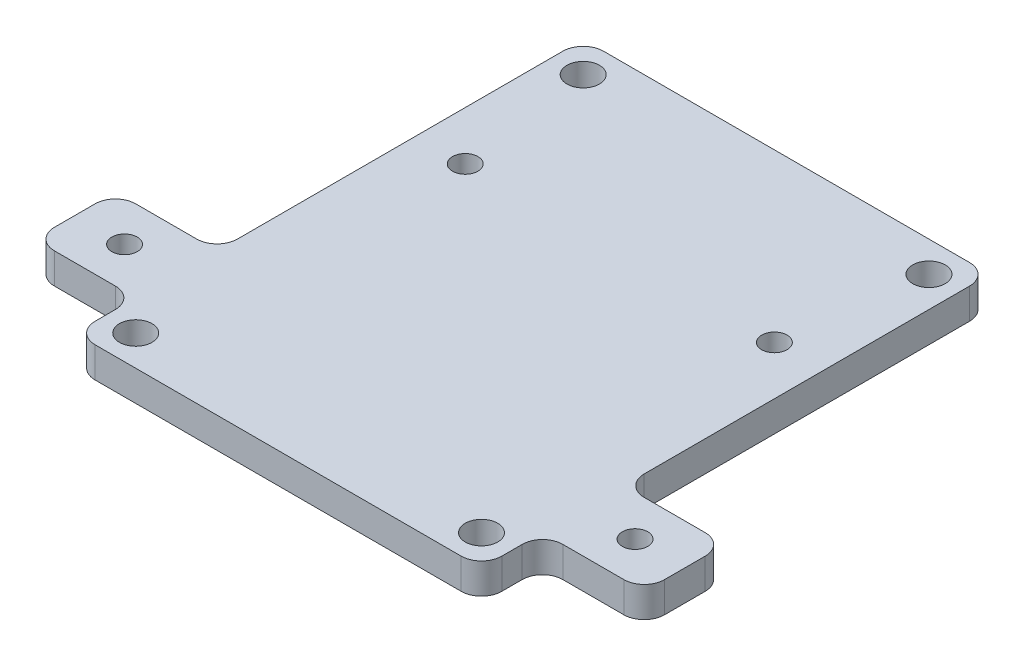
ISO-10303-21;
HEADER;
FILE_DESCRIPTION(('STEP AP214'),'2;1');
FILE_NAME('part.step','',(''),(''),'','','');
FILE_SCHEMA(('AUTOMOTIVE_DESIGN { 1 0 10303 214 1 1 1 1 }'));
ENDSEC;
DATA;
#1=APPLICATION_CONTEXT('core data for automotive mechanical design processes');
#2=APPLICATION_PROTOCOL_DEFINITION('international standard','automotive_design',2000,#1);
#3=PRODUCT_CONTEXT('',#1,'mechanical');
#4=PRODUCT('Part','Part','',(#3));
#5=PRODUCT_RELATED_PRODUCT_CATEGORY('part','',(#4));
#6=PRODUCT_DEFINITION_FORMATION('','',#4);
#7=PRODUCT_DEFINITION_CONTEXT('part definition',#1,'design');
#8=PRODUCT_DEFINITION('design','',#6,#7);
#9=PRODUCT_DEFINITION_SHAPE('','',#8);
#10=(LENGTH_UNIT() NAMED_UNIT(*) SI_UNIT(.MILLI.,.METRE.));
#11=(NAMED_UNIT(*) PLANE_ANGLE_UNIT() SI_UNIT($,.RADIAN.));
#12=(NAMED_UNIT(*) SI_UNIT($,.STERADIAN.) SOLID_ANGLE_UNIT());
#13=UNCERTAINTY_MEASURE_WITH_UNIT(LENGTH_MEASURE(1.E-05),#10,'distance_accuracy_value','');
#14=(GEOMETRIC_REPRESENTATION_CONTEXT(3) GLOBAL_UNCERTAINTY_ASSIGNED_CONTEXT((#13)) GLOBAL_UNIT_ASSIGNED_CONTEXT((#10,
#11,#12)) REPRESENTATION_CONTEXT('',''));
#15=CARTESIAN_POINT('',(0.,0.,0.));
#16=DIRECTION('',(0.,0.,1.));
#17=DIRECTION('',(1.,0.,0.));
#18=AXIS2_PLACEMENT_3D('',#15,#16,#17);
#19=CARTESIAN_POINT('',(-20.,3.,-23.));
#20=DIRECTION('',(1.,0.,0.));
#21=DIRECTION('',(0.,0.,-1.));
#22=AXIS2_PLACEMENT_3D('',#19,#20,#21);
#23=PLANE('',#22);
#24=DIRECTION('',(0.,0.,1.));
#25=VECTOR('',#24,1.);
#26=CARTESIAN_POINT('',(-20.,0.,-23.));
#27=LINE('',#26,#25);
#28=CARTESIAN_POINT('',(-20.,0.,-23.));
#29=VERTEX_POINT('',#28);
#30=CARTESIAN_POINT('',(-20.,0.,9.));
#31=VERTEX_POINT('',#30);
#32=EDGE_CURVE('E260',#29,#31,#27,.T.);
#33=ORIENTED_EDGE('',*,*,#32,.T.);
#34=DIRECTION('',(0.,1.,0.));
#35=VECTOR('',#34,1.);
#36=CARTESIAN_POINT('',(-20.,3.,9.));
#37=LINE('',#36,#35);
#38=CARTESIAN_POINT('',(-20.,3.,9.));
#39=VERTEX_POINT('',#38);
#40=EDGE_CURVE('E295',#31,#39,#37,.T.);
#41=ORIENTED_EDGE('',*,*,#40,.T.);
#42=DIRECTION('',(0.,0.,1.));
#43=VECTOR('',#42,1.);
#44=CARTESIAN_POINT('',(-20.,3.,-23.));
#45=LINE('',#44,#43);
#46=CARTESIAN_POINT('',(-20.,3.,-23.));
#47=VERTEX_POINT('',#46);
#48=EDGE_CURVE('E239',#47,#39,#45,.T.);
#49=ORIENTED_EDGE('',*,*,#48,.F.);
#50=DIRECTION('',(0.,-1.,0.));
#51=VECTOR('',#50,1.);
#52=CARTESIAN_POINT('',(-20.,3.,-23.));
#53=LINE('',#52,#51);
#54=EDGE_CURVE('E286',#47,#29,#53,.T.);
#55=ORIENTED_EDGE('',*,*,#54,.T.);
#56=EDGE_LOOP('',(#33,#41,#49,#55));
#57=FACE_BOUND('',#56,.T.);
#58=ADVANCED_FACE('F36',(#57),#23,.F.);
#59=CARTESIAN_POINT('',(20.,3.,-23.));
#60=DIRECTION('',(-1.,0.,0.));
#61=DIRECTION('',(0.,0.,1.));
#62=AXIS2_PLACEMENT_3D('',#59,#60,#61);
#63=PLANE('',#62);
#64=DIRECTION('',(0.,0.,-1.));
#65=VECTOR('',#64,1.);
#66=CARTESIAN_POINT('',(20.,3.,-23.));
#67=LINE('',#66,#65);
#68=CARTESIAN_POINT('',(20.,3.,9.));
#69=VERTEX_POINT('',#68);
#70=CARTESIAN_POINT('',(20.,3.,-23.));
#71=VERTEX_POINT('',#70);
#72=EDGE_CURVE('E248',#69,#71,#67,.T.);
#73=ORIENTED_EDGE('',*,*,#72,.F.);
#74=DIRECTION('',(0.,-1.,0.));
#75=VECTOR('',#74,1.);
#76=CARTESIAN_POINT('',(20.,3.,9.));
#77=LINE('',#76,#75);
#78=CARTESIAN_POINT('',(20.,0.,9.));
#79=VERTEX_POINT('',#78);
#80=EDGE_CURVE('E299',#69,#79,#77,.T.);
#81=ORIENTED_EDGE('',*,*,#80,.T.);
#82=DIRECTION('',(0.,0.,-1.));
#83=VECTOR('',#82,1.);
#84=CARTESIAN_POINT('',(20.,0.,-23.));
#85=LINE('',#84,#83);
#86=CARTESIAN_POINT('',(20.,0.,-23.));
#87=VERTEX_POINT('',#86);
#88=EDGE_CURVE('E269',#79,#87,#85,.T.);
#89=ORIENTED_EDGE('',*,*,#88,.T.);
#90=DIRECTION('',(0.,-1.,0.));
#91=VECTOR('',#90,1.);
#92=CARTESIAN_POINT('',(20.,3.,-23.));
#93=LINE('',#92,#91);
#94=EDGE_CURVE('E252',#71,#87,#93,.T.);
#95=ORIENTED_EDGE('',*,*,#94,.F.);
#96=EDGE_LOOP('',(#73,#81,#89,#95));
#97=FACE_BOUND('',#96,.T.);
#98=ADVANCED_FACE('F422',(#97),#63,.F.);
#99=CARTESIAN_POINT('',(18.,3.,-23.));
#100=DIRECTION('',(0.,-1.,0.));
#101=DIRECTION('',(0.,0.,-1.));
#102=AXIS2_PLACEMENT_3D('',#99,#100,#101);
#103=CYLINDRICAL_SURFACE('',#102,1.99999999999999);
#104=CARTESIAN_POINT('',(18.,0.,-23.));
#105=DIRECTION('',(0.,1.,0.));
#106=DIRECTION('',(0.,0.,-1.));
#107=AXIS2_PLACEMENT_3D('',#104,#105,#106);
#108=CIRCLE('',#107,1.99999999999999);
#109=CARTESIAN_POINT('',(18.,0.,-25.));
#110=VERTEX_POINT('',#109);
#111=EDGE_CURVE('E228',#87,#110,#108,.T.);
#112=ORIENTED_EDGE('',*,*,#111,.T.);
#113=DIRECTION('',(0.,-1.,0.));
#114=VECTOR('',#113,1.);
#115=CARTESIAN_POINT('',(18.,3.,-25.));
#116=LINE('',#115,#114);
#117=CARTESIAN_POINT('',(18.,3.,-25.));
#118=VERTEX_POINT('',#117);
#119=EDGE_CURVE('E292',#118,#110,#116,.T.);
#120=ORIENTED_EDGE('',*,*,#119,.F.);
#121=CARTESIAN_POINT('',(18.,3.,-23.));
#122=DIRECTION('',(0.,1.,0.));
#123=DIRECTION('',(0.,0.,-1.));
#124=AXIS2_PLACEMENT_3D('',#121,#122,#123);
#125=CIRCLE('',#124,1.99999999999999);
#126=EDGE_CURVE('E230',#71,#118,#125,.T.);
#127=ORIENTED_EDGE('',*,*,#126,.F.);
#128=ORIENTED_EDGE('',*,*,#94,.T.);
#129=EDGE_LOOP('',(#112,#120,#127,#128));
#130=FACE_BOUND('',#129,.T.);
#131=ADVANCED_FACE('F418',(#130),#103,.T.);
#132=CARTESIAN_POINT('',(-18.,3.,-25.));
#133=DIRECTION('',(0.,0.,1.));
#134=DIRECTION('',(1.,0.,0.));
#135=AXIS2_PLACEMENT_3D('',#132,#133,#134);
#136=PLANE('',#135);
#137=DIRECTION('',(-1.,0.,0.));
#138=VECTOR('',#137,1.);
#139=CARTESIAN_POINT('',(-18.,0.,-25.));
#140=LINE('',#139,#138);
#141=CARTESIAN_POINT('',(-18.,0.,-25.));
#142=VERTEX_POINT('',#141);
#143=EDGE_CURVE('E255',#110,#142,#140,.T.);
#144=ORIENTED_EDGE('',*,*,#143,.T.);
#145=DIRECTION('',(0.,-1.,0.));
#146=VECTOR('',#145,1.);
#147=CARTESIAN_POINT('',(-18.,3.,-25.));
#148=LINE('',#147,#146);
#149=CARTESIAN_POINT('',(-18.,3.,-25.));
#150=VERTEX_POINT('',#149);
#151=EDGE_CURVE('E289',#150,#142,#148,.T.);
#152=ORIENTED_EDGE('',*,*,#151,.F.);
#153=DIRECTION('',(-1.,0.,0.));
#154=VECTOR('',#153,1.);
#155=CARTESIAN_POINT('',(-18.,3.,-25.));
#156=LINE('',#155,#154);
#157=EDGE_CURVE('E233',#118,#150,#156,.T.);
#158=ORIENTED_EDGE('',*,*,#157,.F.);
#159=ORIENTED_EDGE('',*,*,#119,.T.);
#160=EDGE_LOOP('',(#144,#152,#158,#159));
#161=FACE_BOUND('',#160,.T.);
#162=ADVANCED_FACE('F415',(#161),#136,.F.);
#163=CARTESIAN_POINT('',(-18.,3.,-23.));
#164=DIRECTION('',(0.,-1.,0.));
#165=DIRECTION('',(0.,0.,-1.));
#166=AXIS2_PLACEMENT_3D('',#163,#164,#165);
#167=CYLINDRICAL_SURFACE('',#166,1.99999999999999);
#168=CARTESIAN_POINT('',(-18.,0.,-23.));
#169=DIRECTION('',(0.,1.,0.));
#170=DIRECTION('',(0.,0.,1.));
#171=AXIS2_PLACEMENT_3D('',#168,#169,#170);
#172=CIRCLE('',#171,1.99999999999999);
#173=EDGE_CURVE('E257',#142,#29,#172,.T.);
#174=ORIENTED_EDGE('',*,*,#173,.T.);
#175=ORIENTED_EDGE('',*,*,#54,.F.);
#176=CARTESIAN_POINT('',(-18.,3.,-23.));
#177=DIRECTION('',(0.,1.,0.));
#178=DIRECTION('',(0.,0.,1.));
#179=AXIS2_PLACEMENT_3D('',#176,#177,#178);
#180=CIRCLE('',#179,1.99999999999999);
#181=EDGE_CURVE('E236',#150,#47,#180,.T.);
#182=ORIENTED_EDGE('',*,*,#181,.F.);
#183=ORIENTED_EDGE('',*,*,#151,.T.);
#184=EDGE_LOOP('',(#174,#175,#182,#183));
#185=FACE_BOUND('',#184,.T.);
#186=ADVANCED_FACE('F409',(#185),#167,.T.);
#187=CARTESIAN_POINT('',(-20.,3.,21.));
#188=VERTEX_POINT('',#187);
#189=CARTESIAN_POINT('',(-20.,3.,23.));
#190=VERTEX_POINT('',#189);
#191=EDGE_CURVE('E238',#188,#190,#45,.T.);
#192=ORIENTED_EDGE('',*,*,#191,.F.);
#193=DIRECTION('',(0.,-1.,0.));
#194=VECTOR('',#193,1.);
#195=CARTESIAN_POINT('',(-20.,3.,21.));
#196=LINE('',#195,#194);
#197=CARTESIAN_POINT('',(-20.,0.,21.));
#198=VERTEX_POINT('',#197);
#199=EDGE_CURVE('E309',#188,#198,#196,.T.);
#200=ORIENTED_EDGE('',*,*,#199,.T.);
#201=CARTESIAN_POINT('',(-20.,0.,23.));
#202=VERTEX_POINT('',#201);
#203=EDGE_CURVE('E259',#198,#202,#27,.T.);
#204=ORIENTED_EDGE('',*,*,#203,.T.);
#205=DIRECTION('',(0.,-1.,0.));
#206=VECTOR('',#205,1.);
#207=CARTESIAN_POINT('',(-20.,3.,23.));
#208=LINE('',#207,#206);
#209=EDGE_CURVE('E283',#190,#202,#208,.T.);
#210=ORIENTED_EDGE('',*,*,#209,.F.);
#211=EDGE_LOOP('',(#192,#200,#204,#210));
#212=FACE_BOUND('',#211,.T.);
#213=ADVANCED_FACE('F535',(#212),#23,.F.);
#214=CARTESIAN_POINT('',(-18.,3.,23.));
#215=DIRECTION('',(0.,-1.,0.));
#216=DIRECTION('',(0.,0.,-1.));
#217=AXIS2_PLACEMENT_3D('',#214,#215,#216);
#218=CYLINDRICAL_SURFACE('',#217,1.99999999999999);
#219=CARTESIAN_POINT('',(-18.,0.,23.));
#220=DIRECTION('',(0.,1.,0.));
#221=DIRECTION('',(0.,0.,1.));
#222=AXIS2_PLACEMENT_3D('',#219,#220,#221);
#223=CIRCLE('',#222,1.99999999999999);
#224=CARTESIAN_POINT('',(-18.,0.,25.));
#225=VERTEX_POINT('',#224);
#226=EDGE_CURVE('E263',#202,#225,#223,.T.);
#227=ORIENTED_EDGE('',*,*,#226,.T.);
#228=DIRECTION('',(0.,-1.,0.));
#229=VECTOR('',#228,1.);
#230=CARTESIAN_POINT('',(-18.,3.,25.));
#231=LINE('',#230,#229);
#232=CARTESIAN_POINT('',(-18.,3.,25.));
#233=VERTEX_POINT('',#232);
#234=EDGE_CURVE('E280',#233,#225,#231,.T.);
#235=ORIENTED_EDGE('',*,*,#234,.F.);
#236=CARTESIAN_POINT('',(-18.,3.,23.));
#237=DIRECTION('',(0.,1.,0.));
#238=DIRECTION('',(0.,0.,1.));
#239=AXIS2_PLACEMENT_3D('',#236,#237,#238);
#240=CIRCLE('',#239,1.99999999999999);
#241=EDGE_CURVE('E242',#190,#233,#240,.T.);
#242=ORIENTED_EDGE('',*,*,#241,.F.);
#243=ORIENTED_EDGE('',*,*,#209,.T.);
#244=EDGE_LOOP('',(#227,#235,#242,#243));
#245=FACE_BOUND('',#244,.T.);
#246=ADVANCED_FACE('F543',(#245),#218,.T.);
#247=CARTESIAN_POINT('',(-18.,3.,25.));
#248=DIRECTION('',(0.,0.,-1.));
#249=DIRECTION('',(-1.,0.,0.));
#250=AXIS2_PLACEMENT_3D('',#247,#248,#249);
#251=PLANE('',#250);
#252=DIRECTION('',(1.,0.,0.));
#253=VECTOR('',#252,1.);
#254=CARTESIAN_POINT('',(-18.,0.,25.));
#255=LINE('',#254,#253);
#256=CARTESIAN_POINT('',(18.,0.,25.));
#257=VERTEX_POINT('',#256);
#258=EDGE_CURVE('E265',#225,#257,#255,.T.);
#259=ORIENTED_EDGE('',*,*,#258,.T.);
#260=DIRECTION('',(0.,-1.,0.));
#261=VECTOR('',#260,1.);
#262=CARTESIAN_POINT('',(18.,3.,25.));
#263=LINE('',#262,#261);
#264=CARTESIAN_POINT('',(18.,3.,25.));
#265=VERTEX_POINT('',#264);
#266=EDGE_CURVE('E277',#265,#257,#263,.T.);
#267=ORIENTED_EDGE('',*,*,#266,.F.);
#268=DIRECTION('',(1.,0.,0.));
#269=VECTOR('',#268,1.);
#270=CARTESIAN_POINT('',(-18.,3.,25.));
#271=LINE('',#270,#269);
#272=EDGE_CURVE('E244',#233,#265,#271,.T.);
#273=ORIENTED_EDGE('',*,*,#272,.F.);
#274=ORIENTED_EDGE('',*,*,#234,.T.);
#275=EDGE_LOOP('',(#259,#267,#273,#274));
#276=FACE_BOUND('',#275,.T.);
#277=ADVANCED_FACE('F549',(#276),#251,.F.);
#278=CARTESIAN_POINT('',(18.,3.,23.));
#279=DIRECTION('',(0.,-1.,0.));
#280=DIRECTION('',(0.,0.,-1.));
#281=AXIS2_PLACEMENT_3D('',#278,#279,#280);
#282=CYLINDRICAL_SURFACE('',#281,1.99999999999999);
#283=CARTESIAN_POINT('',(18.,0.,23.));
#284=DIRECTION('',(0.,1.,0.));
#285=DIRECTION('',(0.,0.,1.));
#286=AXIS2_PLACEMENT_3D('',#283,#284,#285);
#287=CIRCLE('',#286,1.99999999999999);
#288=CARTESIAN_POINT('',(20.,0.,23.));
#289=VERTEX_POINT('',#288);
#290=EDGE_CURVE('E267',#257,#289,#287,.T.);
#291=ORIENTED_EDGE('',*,*,#290,.T.);
#292=DIRECTION('',(0.,-1.,0.));
#293=VECTOR('',#292,1.);
#294=CARTESIAN_POINT('',(20.,3.,23.));
#295=LINE('',#294,#293);
#296=CARTESIAN_POINT('',(20.,3.,23.));
#297=VERTEX_POINT('',#296);
#298=EDGE_CURVE('E274',#297,#289,#295,.T.);
#299=ORIENTED_EDGE('',*,*,#298,.F.);
#300=CARTESIAN_POINT('',(18.,3.,23.));
#301=DIRECTION('',(0.,1.,0.));
#302=DIRECTION('',(0.,0.,1.));
#303=AXIS2_PLACEMENT_3D('',#300,#301,#302);
#304=CIRCLE('',#303,1.99999999999999);
#305=EDGE_CURVE('E246',#265,#297,#304,.T.);
#306=ORIENTED_EDGE('',*,*,#305,.F.);
#307=ORIENTED_EDGE('',*,*,#266,.T.);
#308=EDGE_LOOP('',(#291,#299,#306,#307));
#309=FACE_BOUND('',#308,.T.);
#310=ADVANCED_FACE('F585',(#309),#282,.T.);
#311=CARTESIAN_POINT('',(20.,0.,21.));
#312=VERTEX_POINT('',#311);
#313=EDGE_CURVE('E234',#289,#312,#85,.T.);
#314=ORIENTED_EDGE('',*,*,#313,.T.);
#315=DIRECTION('',(0.,1.,0.));
#316=VECTOR('',#315,1.);
#317=CARTESIAN_POINT('',(20.,3.,21.));
#318=LINE('',#317,#316);
#319=CARTESIAN_POINT('',(20.,3.,21.));
#320=VERTEX_POINT('',#319);
#321=EDGE_CURVE('E304',#312,#320,#318,.T.);
#322=ORIENTED_EDGE('',*,*,#321,.T.);
#323=EDGE_CURVE('E249',#297,#320,#67,.T.);
#324=ORIENTED_EDGE('',*,*,#323,.F.);
#325=ORIENTED_EDGE('',*,*,#298,.T.);
#326=EDGE_LOOP('',(#314,#322,#324,#325));
#327=FACE_BOUND('',#326,.T.);
#328=ADVANCED_FACE('F334',(#327),#63,.F.);
#329=CARTESIAN_POINT('',(18.,3.,-23.));
#330=DIRECTION('',(0.,-1.,0.));
#331=DIRECTION('',(0.,0.,-1.));
#332=AXIS2_PLACEMENT_3D('',#329,#330,#331);
#333=PLANE('',#332);
#334=CARTESIAN_POINT('',(-17.,3.,22.));
#335=DIRECTION('',(0.,1.,0.));
#336=DIRECTION('',(0.,0.,-1.));
#337=AXIS2_PLACEMENT_3D('',#334,#335,#336);
#338=CIRCLE('',#337,1.6);
#339=CARTESIAN_POINT('',(-17.,3.,20.4));
#340=VERTEX_POINT('',#339);
#341=EDGE_CURVE('E486',#340,#340,#338,.T.);
#342=ORIENTED_EDGE('',*,*,#341,.F.);
#343=EDGE_LOOP('',(#342));
#344=FACE_BOUND('',#343,.T.);
#345=CARTESIAN_POINT('',(17.,3.,22.));
#346=DIRECTION('',(0.,1.,0.));
#347=DIRECTION('',(0.,0.,1.));
#348=AXIS2_PLACEMENT_3D('',#345,#346,#347);
#349=CIRCLE('',#348,1.6);
#350=CARTESIAN_POINT('',(17.,3.,23.6));
#351=VERTEX_POINT('',#350);
#352=EDGE_CURVE('E480',#351,#351,#349,.T.);
#353=ORIENTED_EDGE('',*,*,#352,.F.);
#354=EDGE_LOOP('',(#353));
#355=FACE_BOUND('',#354,.T.);
#356=CARTESIAN_POINT('',(17.,3.,-22.));
#357=DIRECTION('',(0.,1.,0.));
#358=DIRECTION('',(0.,0.,-1.));
#359=AXIS2_PLACEMENT_3D('',#356,#357,#358);
#360=CIRCLE('',#359,1.6);
#361=CARTESIAN_POINT('',(17.,3.,-23.6));
#362=VERTEX_POINT('',#361);
#363=EDGE_CURVE('E474',#362,#362,#360,.T.);
#364=ORIENTED_EDGE('',*,*,#363,.F.);
#365=EDGE_LOOP('',(#364));
#366=FACE_BOUND('',#365,.T.);
#367=CARTESIAN_POINT('',(-17.,3.,-22.));
#368=DIRECTION('',(0.,1.,0.));
#369=DIRECTION('',(0.,0.,1.));
#370=AXIS2_PLACEMENT_3D('',#367,#368,#369);
#371=CIRCLE('',#370,1.6);
#372=CARTESIAN_POINT('',(-17.,3.,-20.4));
#373=VERTEX_POINT('',#372);
#374=EDGE_CURVE('E468',#373,#373,#371,.T.);
#375=ORIENTED_EDGE('',*,*,#374,.F.);
#376=EDGE_LOOP('',(#375));
#377=FACE_BOUND('',#376,.T.);
#378=CARTESIAN_POINT('',(-15.2,3.,-8.6));
#379=DIRECTION('',(0.,1.,0.));
#380=DIRECTION('',(0.,0.,1.));
#381=AXIS2_PLACEMENT_3D('',#378,#379,#380);
#382=CIRCLE('',#381,1.25);
#383=CARTESIAN_POINT('',(-15.2,3.,-7.35));
#384=VERTEX_POINT('',#383);
#385=EDGE_CURVE('E463',#384,#384,#382,.T.);
#386=ORIENTED_EDGE('',*,*,#385,.F.);
#387=EDGE_LOOP('',(#386));
#388=FACE_BOUND('',#387,.T.);
#389=CARTESIAN_POINT('',(15.2,3.,-8.6));
#390=DIRECTION('',(0.,1.,0.));
#391=DIRECTION('',(0.,0.,-1.));
#392=AXIS2_PLACEMENT_3D('',#389,#390,#391);
#393=CIRCLE('',#392,1.25000000000001);
#394=CARTESIAN_POINT('',(15.2,3.,-9.85000000000001));
#395=VERTEX_POINT('',#394);
#396=EDGE_CURVE('E457',#395,#395,#393,.T.);
#397=ORIENTED_EDGE('',*,*,#396,.F.);
#398=EDGE_LOOP('',(#397));
#399=FACE_BOUND('',#398,.T.);
#400=CARTESIAN_POINT('',(25.1,3.,15.));
#401=DIRECTION('',(0.,1.,0.));
#402=DIRECTION('',(0.,0.,-1.));
#403=AXIS2_PLACEMENT_3D('',#400,#401,#402);
#404=CIRCLE('',#403,1.25);
#405=CARTESIAN_POINT('',(25.1,3.,13.75));
#406=VERTEX_POINT('',#405);
#407=EDGE_CURVE('E450',#406,#406,#404,.T.);
#408=ORIENTED_EDGE('',*,*,#407,.F.);
#409=EDGE_LOOP('',(#408));
#410=FACE_BOUND('',#409,.T.);
#411=CARTESIAN_POINT('',(-25.1,3.,15.));
#412=DIRECTION('',(0.,1.,0.));
#413=DIRECTION('',(0.,0.,1.));
#414=AXIS2_PLACEMENT_3D('',#411,#412,#413);
#415=CIRCLE('',#414,1.25);
#416=CARTESIAN_POINT('',(-25.1,3.,16.25));
#417=VERTEX_POINT('',#416);
#418=EDGE_CURVE('E444',#417,#417,#415,.T.);
#419=ORIENTED_EDGE('',*,*,#418,.F.);
#420=EDGE_LOOP('',(#419));
#421=FACE_BOUND('',#420,.T.);
#422=ORIENTED_EDGE('',*,*,#323,.T.);
#423=CARTESIAN_POINT('',(22.,3.,21.));
#424=DIRECTION('',(0.,-1.,0.));
#425=DIRECTION('',(0.,0.,-1.));
#426=AXIS2_PLACEMENT_3D('',#423,#424,#425);
#427=CIRCLE('',#426,2.);
#428=CARTESIAN_POINT('',(22.,3.,19.));
#429=VERTEX_POINT('',#428);
#430=EDGE_CURVE('E321',#320,#429,#427,.T.);
#431=ORIENTED_EDGE('',*,*,#430,.T.);
#432=DIRECTION('',(1.,0.,0.));
#433=VECTOR('',#432,1.);
#434=CARTESIAN_POINT('',(-28.,3.,19.));
#435=LINE('',#434,#433);
#436=CARTESIAN_POINT('',(28.,3.,19.));
#437=VERTEX_POINT('',#436);
#438=EDGE_CURVE('E342',#429,#437,#435,.T.);
#439=ORIENTED_EDGE('',*,*,#438,.T.);
#440=CARTESIAN_POINT('',(28.,3.,17.));
#441=DIRECTION('',(0.,1.,0.));
#442=DIRECTION('',(0.,0.,1.));
#443=AXIS2_PLACEMENT_3D('',#440,#441,#442);
#444=CIRCLE('',#443,2.00000000000001);
#445=CARTESIAN_POINT('',(30.,3.,17.));
#446=VERTEX_POINT('',#445);
#447=EDGE_CURVE('E352',#437,#446,#444,.T.);
#448=ORIENTED_EDGE('',*,*,#447,.T.);
#449=DIRECTION('',(0.,0.,-1.));
#450=VECTOR('',#449,1.);
#451=CARTESIAN_POINT('',(30.,3.,13.));
#452=LINE('',#451,#450);
#453=CARTESIAN_POINT('',(30.,3.,13.));
#454=VERTEX_POINT('',#453);
#455=EDGE_CURVE('E207',#446,#454,#452,.T.);
#456=ORIENTED_EDGE('',*,*,#455,.T.);
#457=CARTESIAN_POINT('',(28.,3.,13.));
#458=DIRECTION('',(0.,1.,0.));
#459=DIRECTION('',(0.,0.,-1.));
#460=AXIS2_PLACEMENT_3D('',#457,#458,#459);
#461=CIRCLE('',#460,2.);
#462=CARTESIAN_POINT('',(28.,3.,11.));
#463=VERTEX_POINT('',#462);
#464=EDGE_CURVE('E366',#454,#463,#461,.T.);
#465=ORIENTED_EDGE('',*,*,#464,.T.);
#466=DIRECTION('',(-1.,0.,0.));
#467=VECTOR('',#466,1.);
#468=CARTESIAN_POINT('',(-28.,3.,11.));
#469=LINE('',#468,#467);
#470=CARTESIAN_POINT('',(22.,3.,11.));
#471=VERTEX_POINT('',#470);
#472=EDGE_CURVE('E362',#463,#471,#469,.T.);
#473=ORIENTED_EDGE('',*,*,#472,.T.);
#474=CARTESIAN_POINT('',(22.,3.,9.));
#475=DIRECTION('',(0.,-1.,0.));
#476=DIRECTION('',(0.,0.,-1.));
#477=AXIS2_PLACEMENT_3D('',#474,#475,#476);
#478=CIRCLE('',#477,2.);
#479=EDGE_CURVE('E319',#471,#69,#478,.T.);
#480=ORIENTED_EDGE('',*,*,#479,.T.);
#481=ORIENTED_EDGE('',*,*,#72,.T.);
#482=ORIENTED_EDGE('',*,*,#126,.T.);
#483=ORIENTED_EDGE('',*,*,#157,.T.);
#484=ORIENTED_EDGE('',*,*,#181,.T.);
#485=ORIENTED_EDGE('',*,*,#48,.T.);
#486=CARTESIAN_POINT('',(-22.,3.,9.));
#487=DIRECTION('',(0.,-1.,0.));
#488=DIRECTION('',(0.,0.,-1.));
#489=AXIS2_PLACEMENT_3D('',#486,#487,#488);
#490=CIRCLE('',#489,2.);
#491=CARTESIAN_POINT('',(-22.,3.,11.));
#492=VERTEX_POINT('',#491);
#493=EDGE_CURVE('E313',#39,#492,#490,.T.);
#494=ORIENTED_EDGE('',*,*,#493,.T.);
#495=CARTESIAN_POINT('',(-28.,3.,11.));
#496=VERTEX_POINT('',#495);
#497=EDGE_CURVE('E365',#492,#496,#469,.T.);
#498=ORIENTED_EDGE('',*,*,#497,.T.);
#499=CARTESIAN_POINT('',(-28.,3.,13.));
#500=DIRECTION('',(0.,1.,0.));
#501=DIRECTION('',(0.,0.,1.));
#502=AXIS2_PLACEMENT_3D('',#499,#500,#501);
#503=CIRCLE('',#502,2.);
#504=CARTESIAN_POINT('',(-30.,3.,13.));
#505=VERTEX_POINT('',#504);
#506=EDGE_CURVE('E220',#496,#505,#503,.T.);
#507=ORIENTED_EDGE('',*,*,#506,.T.);
#508=DIRECTION('',(0.,0.,1.));
#509=VECTOR('',#508,1.);
#510=CARTESIAN_POINT('',(-30.,3.,13.));
#511=LINE('',#510,#509);
#512=CARTESIAN_POINT('',(-30.,3.,17.));
#513=VERTEX_POINT('',#512);
#514=EDGE_CURVE('E354',#505,#513,#511,.T.);
#515=ORIENTED_EDGE('',*,*,#514,.T.);
#516=CARTESIAN_POINT('',(-28.,3.,17.));
#517=DIRECTION('',(0.,1.,0.));
#518=DIRECTION('',(0.,0.,1.));
#519=AXIS2_PLACEMENT_3D('',#516,#517,#518);
#520=CIRCLE('',#519,2.00000000000001);
#521=CARTESIAN_POINT('',(-28.,3.,19.));
#522=VERTEX_POINT('',#521);
#523=EDGE_CURVE('E350',#513,#522,#520,.T.);
#524=ORIENTED_EDGE('',*,*,#523,.T.);
#525=CARTESIAN_POINT('',(-22.,3.,19.));
#526=VERTEX_POINT('',#525);
#527=EDGE_CURVE('E349',#522,#526,#435,.T.);
#528=ORIENTED_EDGE('',*,*,#527,.T.);
#529=CARTESIAN_POINT('',(-22.,3.,21.));
#530=DIRECTION('',(0.,-1.,0.));
#531=DIRECTION('',(0.,0.,-1.));
#532=AXIS2_PLACEMENT_3D('',#529,#530,#531);
#533=CIRCLE('',#532,2.);
#534=EDGE_CURVE('E11',#526,#188,#533,.T.);
#535=ORIENTED_EDGE('',*,*,#534,.T.);
#536=ORIENTED_EDGE('',*,*,#191,.T.);
#537=ORIENTED_EDGE('',*,*,#241,.T.);
#538=ORIENTED_EDGE('',*,*,#272,.T.);
#539=ORIENTED_EDGE('',*,*,#305,.T.);
#540=EDGE_LOOP('',(#422,#431,#439,#448,#456,#465,#473,#480,#481,#482,#483,#484,#485,#494,#498,
#507,#515,#524,#528,#535,#536,#537,#538,#539));
#541=FACE_BOUND('',#540,.T.);
#542=ADVANCED_FACE('F340',(#344,#355,#366,#377,#388,#399,#410,#421,#541),#333,.F.);
#543=CARTESIAN_POINT('',(18.,0.,-23.));
#544=DIRECTION('',(0.,-1.,0.));
#545=DIRECTION('',(0.,0.,-1.));
#546=AXIS2_PLACEMENT_3D('',#543,#544,#545);
#547=PLANE('',#546);
#548=CARTESIAN_POINT('',(-17.,0.,22.));
#549=DIRECTION('',(0.,1.,0.));
#550=DIRECTION('',(0.,0.,-1.));
#551=AXIS2_PLACEMENT_3D('',#548,#549,#550);
#552=CIRCLE('',#551,1.6);
#553=CARTESIAN_POINT('',(-17.,0.,20.4));
#554=VERTEX_POINT('',#553);
#555=EDGE_CURVE('E471',#554,#554,#552,.T.);
#556=ORIENTED_EDGE('',*,*,#555,.T.);
#557=EDGE_LOOP('',(#556));
#558=FACE_BOUND('',#557,.T.);
#559=CARTESIAN_POINT('',(17.,0.,22.));
#560=DIRECTION('',(0.,1.,0.));
#561=DIRECTION('',(0.,0.,1.));
#562=AXIS2_PLACEMENT_3D('',#559,#560,#561);
#563=CIRCLE('',#562,1.6);
#564=CARTESIAN_POINT('',(17.,0.,23.6));
#565=VERTEX_POINT('',#564);
#566=EDGE_CURVE('E483',#565,#565,#563,.T.);
#567=ORIENTED_EDGE('',*,*,#566,.T.);
#568=EDGE_LOOP('',(#567));
#569=FACE_BOUND('',#568,.T.);
#570=CARTESIAN_POINT('',(17.,0.,-22.));
#571=DIRECTION('',(0.,1.,0.));
#572=DIRECTION('',(0.,0.,-1.));
#573=AXIS2_PLACEMENT_3D('',#570,#571,#572);
#574=CIRCLE('',#573,1.6);
#575=CARTESIAN_POINT('',(17.,0.,-23.6));
#576=VERTEX_POINT('',#575);
#577=EDGE_CURVE('E477',#576,#576,#574,.T.);
#578=ORIENTED_EDGE('',*,*,#577,.T.);
#579=EDGE_LOOP('',(#578));
#580=FACE_BOUND('',#579,.T.);
#581=CARTESIAN_POINT('',(-17.,0.,-22.));
#582=DIRECTION('',(0.,1.,0.));
#583=DIRECTION('',(0.,0.,1.));
#584=AXIS2_PLACEMENT_3D('',#581,#582,#583);
#585=CIRCLE('',#584,1.6);
#586=CARTESIAN_POINT('',(-17.,0.,-20.4));
#587=VERTEX_POINT('',#586);
#588=EDGE_CURVE('E454',#587,#587,#585,.T.);
#589=ORIENTED_EDGE('',*,*,#588,.T.);
#590=EDGE_LOOP('',(#589));
#591=FACE_BOUND('',#590,.T.);
#592=CARTESIAN_POINT('',(-15.2,0.,-8.6));
#593=DIRECTION('',(0.,1.,0.));
#594=DIRECTION('',(0.,0.,1.));
#595=AXIS2_PLACEMENT_3D('',#592,#593,#594);
#596=CIRCLE('',#595,1.25);
#597=CARTESIAN_POINT('',(-15.2,0.,-7.35));
#598=VERTEX_POINT('',#597);
#599=EDGE_CURVE('E447',#598,#598,#596,.T.);
#600=ORIENTED_EDGE('',*,*,#599,.T.);
#601=EDGE_LOOP('',(#600));
#602=FACE_BOUND('',#601,.T.);
#603=CARTESIAN_POINT('',(15.2,0.,-8.6));
#604=DIRECTION('',(0.,1.,0.));
#605=DIRECTION('',(0.,0.,-1.));
#606=AXIS2_PLACEMENT_3D('',#603,#604,#605);
#607=CIRCLE('',#606,1.25000000000001);
#608=CARTESIAN_POINT('',(15.2,0.,-9.85000000000001));
#609=VERTEX_POINT('',#608);
#610=EDGE_CURVE('E460',#609,#609,#607,.T.);
#611=ORIENTED_EDGE('',*,*,#610,.T.);
#612=EDGE_LOOP('',(#611));
#613=FACE_BOUND('',#612,.T.);
#614=CARTESIAN_POINT('',(25.1,0.,15.));
#615=DIRECTION('',(0.,1.,0.));
#616=DIRECTION('',(0.,0.,-1.));
#617=AXIS2_PLACEMENT_3D('',#614,#615,#616);
#618=CIRCLE('',#617,1.25);
#619=CARTESIAN_POINT('',(25.1,0.,13.75));
#620=VERTEX_POINT('',#619);
#621=EDGE_CURVE('E453',#620,#620,#618,.T.);
#622=ORIENTED_EDGE('',*,*,#621,.T.);
#623=EDGE_LOOP('',(#622));
#624=FACE_BOUND('',#623,.T.);
#625=CARTESIAN_POINT('',(-25.1,0.,15.));
#626=DIRECTION('',(0.,1.,0.));
#627=DIRECTION('',(0.,0.,1.));
#628=AXIS2_PLACEMENT_3D('',#625,#626,#627);
#629=CIRCLE('',#628,1.25);
#630=CARTESIAN_POINT('',(-25.1,0.,16.25));
#631=VERTEX_POINT('',#630);
#632=EDGE_CURVE('E368',#631,#631,#629,.T.);
#633=ORIENTED_EDGE('',*,*,#632,.T.);
#634=EDGE_LOOP('',(#633));
#635=FACE_BOUND('',#634,.T.);
#636=ORIENTED_EDGE('',*,*,#203,.F.);
#637=CARTESIAN_POINT('',(-22.,0.,21.));
#638=DIRECTION('',(0.,-1.,0.));
#639=DIRECTION('',(0.,0.,-1.));
#640=AXIS2_PLACEMENT_3D('',#637,#638,#639);
#641=CIRCLE('',#640,2.);
#642=CARTESIAN_POINT('',(-22.,0.,19.));
#643=VERTEX_POINT('',#642);
#644=EDGE_CURVE('E44',#198,#643,#641,.F.);
#645=ORIENTED_EDGE('',*,*,#644,.T.);
#646=DIRECTION('',(1.,0.,0.));
#647=VECTOR('',#646,1.);
#648=CARTESIAN_POINT('',(-28.,0.,19.));
#649=LINE('',#648,#647);
#650=CARTESIAN_POINT('',(-28.,0.,19.));
#651=VERTEX_POINT('',#650);
#652=EDGE_CURVE('E380',#651,#643,#649,.T.);
#653=ORIENTED_EDGE('',*,*,#652,.F.);
#654=CARTESIAN_POINT('',(-28.,0.,17.));
#655=DIRECTION('',(0.,-1.,0.));
#656=DIRECTION('',(0.,0.,-1.));
#657=AXIS2_PLACEMENT_3D('',#654,#655,#656);
#658=CIRCLE('',#657,2.00000000000001);
#659=CARTESIAN_POINT('',(-30.,0.,17.));
#660=VERTEX_POINT('',#659);
#661=EDGE_CURVE('E382',#660,#651,#658,.F.);
#662=ORIENTED_EDGE('',*,*,#661,.F.);
#663=DIRECTION('',(0.,0.,1.));
#664=VECTOR('',#663,1.);
#665=CARTESIAN_POINT('',(-30.,0.,13.));
#666=LINE('',#665,#664);
#667=CARTESIAN_POINT('',(-30.,0.,13.));
#668=VERTEX_POINT('',#667);
#669=EDGE_CURVE('E213',#668,#660,#666,.T.);
#670=ORIENTED_EDGE('',*,*,#669,.F.);
#671=CARTESIAN_POINT('',(-28.,0.,13.));
#672=DIRECTION('',(0.,-1.,0.));
#673=DIRECTION('',(0.,0.,-1.));
#674=AXIS2_PLACEMENT_3D('',#671,#672,#673);
#675=CIRCLE('',#674,2.);
#676=CARTESIAN_POINT('',(-28.,0.,11.));
#677=VERTEX_POINT('',#676);
#678=EDGE_CURVE('E210',#677,#668,#675,.F.);
#679=ORIENTED_EDGE('',*,*,#678,.F.);
#680=DIRECTION('',(-1.,0.,0.));
#681=VECTOR('',#680,1.);
#682=CARTESIAN_POINT('',(-28.,0.,11.));
#683=LINE('',#682,#681);
#684=CARTESIAN_POINT('',(-22.,0.,11.));
#685=VERTEX_POINT('',#684);
#686=EDGE_CURVE('E196',#685,#677,#683,.T.);
#687=ORIENTED_EDGE('',*,*,#686,.F.);
#688=CARTESIAN_POINT('',(-22.,0.,9.));
#689=DIRECTION('',(0.,-1.,0.));
#690=DIRECTION('',(0.,0.,-1.));
#691=AXIS2_PLACEMENT_3D('',#688,#689,#690);
#692=CIRCLE('',#691,2.);
#693=EDGE_CURVE('E315',#685,#31,#692,.F.);
#694=ORIENTED_EDGE('',*,*,#693,.T.);
#695=ORIENTED_EDGE('',*,*,#32,.F.);
#696=ORIENTED_EDGE('',*,*,#173,.F.);
#697=ORIENTED_EDGE('',*,*,#143,.F.);
#698=ORIENTED_EDGE('',*,*,#111,.F.);
#699=ORIENTED_EDGE('',*,*,#88,.F.);
#700=CARTESIAN_POINT('',(22.,0.,9.));
#701=DIRECTION('',(0.,-1.,0.));
#702=DIRECTION('',(0.,0.,-1.));
#703=AXIS2_PLACEMENT_3D('',#700,#701,#702);
#704=CIRCLE('',#703,2.);
#705=CARTESIAN_POINT('',(22.,0.,11.));
#706=VERTEX_POINT('',#705);
#707=EDGE_CURVE('E317',#79,#706,#704,.F.);
#708=ORIENTED_EDGE('',*,*,#707,.T.);
#709=CARTESIAN_POINT('',(28.,0.,11.));
#710=VERTEX_POINT('',#709);
#711=EDGE_CURVE('E206',#710,#706,#683,.T.);
#712=ORIENTED_EDGE('',*,*,#711,.F.);
#713=CARTESIAN_POINT('',(28.,0.,13.));
#714=DIRECTION('',(0.,-1.,0.));
#715=DIRECTION('',(0.,0.,-1.));
#716=AXIS2_PLACEMENT_3D('',#713,#714,#715);
#717=CIRCLE('',#716,2.);
#718=CARTESIAN_POINT('',(30.,0.,13.));
#719=VERTEX_POINT('',#718);
#720=EDGE_CURVE('E229',#719,#710,#717,.F.);
#721=ORIENTED_EDGE('',*,*,#720,.F.);
#722=DIRECTION('',(0.,0.,-1.));
#723=VECTOR('',#722,1.);
#724=CARTESIAN_POINT('',(30.,0.,13.));
#725=LINE('',#724,#723);
#726=CARTESIAN_POINT('',(30.,0.,17.));
#727=VERTEX_POINT('',#726);
#728=EDGE_CURVE('E373',#727,#719,#725,.T.);
#729=ORIENTED_EDGE('',*,*,#728,.F.);
#730=CARTESIAN_POINT('',(28.,0.,17.));
#731=DIRECTION('',(0.,-1.,0.));
#732=DIRECTION('',(0.,0.,-1.));
#733=AXIS2_PLACEMENT_3D('',#730,#731,#732);
#734=CIRCLE('',#733,2.00000000000001);
#735=CARTESIAN_POINT('',(28.,0.,19.));
#736=VERTEX_POINT('',#735);
#737=EDGE_CURVE('E377',#736,#727,#734,.F.);
#738=ORIENTED_EDGE('',*,*,#737,.F.);
#739=CARTESIAN_POINT('',(22.,0.,19.));
#740=VERTEX_POINT('',#739);
#741=EDGE_CURVE('E329',#740,#736,#649,.T.);
#742=ORIENTED_EDGE('',*,*,#741,.F.);
#743=CARTESIAN_POINT('',(22.,0.,21.));
#744=DIRECTION('',(0.,-1.,0.));
#745=DIRECTION('',(0.,0.,-1.));
#746=AXIS2_PLACEMENT_3D('',#743,#744,#745);
#747=CIRCLE('',#746,2.);
#748=EDGE_CURVE('E323',#740,#312,#747,.F.);
#749=ORIENTED_EDGE('',*,*,#748,.T.);
#750=ORIENTED_EDGE('',*,*,#313,.F.);
#751=ORIENTED_EDGE('',*,*,#290,.F.);
#752=ORIENTED_EDGE('',*,*,#258,.F.);
#753=ORIENTED_EDGE('',*,*,#226,.F.);
#754=EDGE_LOOP('',(#636,#645,#653,#662,#670,#679,#687,#694,#695,#696,#697,#698,#699,#708,#712,
#721,#729,#738,#742,#749,#750,#751,#752,#753));
#755=FACE_BOUND('',#754,.T.);
#756=ADVANCED_FACE('F211',(#558,#569,#580,#591,#602,#613,#624,#635,#755),#547,.T.);
#757=CARTESIAN_POINT('',(30.,-60.5309838016862,13.));
#758=DIRECTION('',(1.,0.,0.));
#759=DIRECTION('',(0.,0.,-1.));
#760=AXIS2_PLACEMENT_3D('',#757,#758,#759);
#761=PLANE('',#760);
#762=DIRECTION('',(0.,1.,0.));
#763=VECTOR('',#762,1.);
#764=CARTESIAN_POINT('',(30.,-60.5309838016862,17.));
#765=LINE('',#764,#763);
#766=EDGE_CURVE('E376',#727,#446,#765,.T.);
#767=ORIENTED_EDGE('',*,*,#766,.F.);
#768=ORIENTED_EDGE('',*,*,#728,.T.);
#769=DIRECTION('',(0.,1.,0.));
#770=VECTOR('',#769,1.);
#771=CARTESIAN_POINT('',(30.,-60.5309838016862,13.));
#772=LINE('',#771,#770);
#773=EDGE_CURVE('E372',#719,#454,#772,.T.);
#774=ORIENTED_EDGE('',*,*,#773,.T.);
#775=ORIENTED_EDGE('',*,*,#455,.F.);
#776=EDGE_LOOP('',(#767,#768,#774,#775));
#777=FACE_BOUND('',#776,.T.);
#778=ADVANCED_FACE('F440',(#777),#761,.T.);
#779=CARTESIAN_POINT('',(28.,-60.5309838016862,13.));
#780=DIRECTION('',(0.,1.,0.));
#781=DIRECTION('',(0.,0.,1.));
#782=AXIS2_PLACEMENT_3D('',#779,#780,#781);
#783=CYLINDRICAL_SURFACE('',#782,2.);
#784=ORIENTED_EDGE('',*,*,#773,.F.);
#785=ORIENTED_EDGE('',*,*,#720,.T.);
#786=DIRECTION('',(0.,1.,0.));
#787=VECTOR('',#786,1.);
#788=CARTESIAN_POINT('',(28.,-60.5309838016862,11.));
#789=LINE('',#788,#787);
#790=EDGE_CURVE('E226',#710,#463,#789,.T.);
#791=ORIENTED_EDGE('',*,*,#790,.T.);
#792=ORIENTED_EDGE('',*,*,#464,.F.);
#793=EDGE_LOOP('',(#784,#785,#791,#792));
#794=FACE_BOUND('',#793,.T.);
#795=ADVANCED_FACE('F437',(#794),#783,.T.);
#796=CARTESIAN_POINT('',(28.,-60.5309838016862,17.));
#797=DIRECTION('',(0.,1.,0.));
#798=DIRECTION('',(0.,0.,1.));
#799=AXIS2_PLACEMENT_3D('',#796,#797,#798);
#800=CYLINDRICAL_SURFACE('',#799,2.00000000000001);
#801=DIRECTION('',(0.,1.,0.));
#802=VECTOR('',#801,1.);
#803=CARTESIAN_POINT('',(28.,-60.5309838016862,19.));
#804=LINE('',#803,#802);
#805=EDGE_CURVE('E347',#736,#437,#804,.T.);
#806=ORIENTED_EDGE('',*,*,#805,.F.);
#807=ORIENTED_EDGE('',*,*,#737,.T.);
#808=ORIENTED_EDGE('',*,*,#766,.T.);
#809=ORIENTED_EDGE('',*,*,#447,.F.);
#810=EDGE_LOOP('',(#806,#807,#808,#809));
#811=FACE_BOUND('',#810,.T.);
#812=ADVANCED_FACE('F442',(#811),#800,.T.);
#813=CARTESIAN_POINT('',(-28.,-60.5309838016862,19.));
#814=DIRECTION('',(0.,0.,1.));
#815=DIRECTION('',(1.,0.,0.));
#816=AXIS2_PLACEMENT_3D('',#813,#814,#815);
#817=PLANE('',#816);
#818=ORIENTED_EDGE('',*,*,#438,.F.);
#819=DIRECTION('',(0.,1.,0.));
#820=VECTOR('',#819,1.);
#821=CARTESIAN_POINT('',(22.,-60.5309838016862,19.));
#822=LINE('',#821,#820);
#823=EDGE_CURVE('E307',#429,#740,#822,.F.);
#824=ORIENTED_EDGE('',*,*,#823,.T.);
#825=ORIENTED_EDGE('',*,*,#741,.T.);
#826=ORIENTED_EDGE('',*,*,#805,.T.);
#827=EDGE_LOOP('',(#818,#824,#825,#826));
#828=FACE_BOUND('',#827,.T.);
#829=ADVANCED_FACE('F345',(#828),#817,.T.);
#830=CARTESIAN_POINT('',(-28.,-60.5309838016862,11.));
#831=DIRECTION('',(0.,0.,-1.));
#832=DIRECTION('',(-1.,0.,0.));
#833=AXIS2_PLACEMENT_3D('',#830,#831,#832);
#834=PLANE('',#833);
#835=ORIENTED_EDGE('',*,*,#711,.T.);
#836=DIRECTION('',(0.,-1.,0.));
#837=VECTOR('',#836,1.);
#838=CARTESIAN_POINT('',(22.,-60.5309838016862,11.));
#839=LINE('',#838,#837);
#840=EDGE_CURVE('E302',#706,#471,#839,.F.);
#841=ORIENTED_EDGE('',*,*,#840,.T.);
#842=ORIENTED_EDGE('',*,*,#472,.F.);
#843=ORIENTED_EDGE('',*,*,#790,.F.);
#844=EDGE_LOOP('',(#835,#841,#842,#843));
#845=FACE_BOUND('',#844,.T.);
#846=ADVANCED_FACE('F428',(#845),#834,.T.);
#847=ORIENTED_EDGE('',*,*,#497,.F.);
#848=DIRECTION('',(0.,1.,0.));
#849=VECTOR('',#848,1.);
#850=CARTESIAN_POINT('',(-22.,-60.5309838016862,11.));
#851=LINE('',#850,#849);
#852=EDGE_CURVE('E204',#492,#685,#851,.F.);
#853=ORIENTED_EDGE('',*,*,#852,.T.);
#854=ORIENTED_EDGE('',*,*,#686,.T.);
#855=DIRECTION('',(0.,1.,0.));
#856=VECTOR('',#855,1.);
#857=CARTESIAN_POINT('',(-28.,-60.5309838016862,11.));
#858=LINE('',#857,#856);
#859=EDGE_CURVE('E201',#677,#496,#858,.T.);
#860=ORIENTED_EDGE('',*,*,#859,.T.);
#861=EDGE_LOOP('',(#847,#853,#854,#860));
#862=FACE_BOUND('',#861,.T.);
#863=ADVANCED_FACE('F199',(#862),#834,.T.);
#864=ORIENTED_EDGE('',*,*,#652,.T.);
#865=DIRECTION('',(0.,-1.,0.));
#866=VECTOR('',#865,1.);
#867=CARTESIAN_POINT('',(-22.,-60.5309838016862,19.));
#868=LINE('',#867,#866);
#869=EDGE_CURVE('E57',#643,#526,#868,.F.);
#870=ORIENTED_EDGE('',*,*,#869,.T.);
#871=ORIENTED_EDGE('',*,*,#527,.F.);
#872=DIRECTION('',(0.,1.,0.));
#873=VECTOR('',#872,1.);
#874=CARTESIAN_POINT('',(-28.,-60.5309838016862,19.));
#875=LINE('',#874,#873);
#876=EDGE_CURVE('E385',#651,#522,#875,.T.);
#877=ORIENTED_EDGE('',*,*,#876,.F.);
#878=EDGE_LOOP('',(#864,#870,#871,#877));
#879=FACE_BOUND('',#878,.T.);
#880=ADVANCED_FACE('F557',(#879),#817,.T.);
#881=CARTESIAN_POINT('',(-28.,-60.5309838016862,13.));
#882=DIRECTION('',(0.,1.,0.));
#883=DIRECTION('',(0.,0.,1.));
#884=AXIS2_PLACEMENT_3D('',#881,#882,#883);
#885=CYLINDRICAL_SURFACE('',#884,2.);
#886=ORIENTED_EDGE('',*,*,#859,.F.);
#887=ORIENTED_EDGE('',*,*,#678,.T.);
#888=DIRECTION('',(0.,1.,0.));
#889=VECTOR('',#888,1.);
#890=CARTESIAN_POINT('',(-30.,-60.5309838016862,13.));
#891=LINE('',#890,#889);
#892=EDGE_CURVE('E216',#668,#505,#891,.T.);
#893=ORIENTED_EDGE('',*,*,#892,.T.);
#894=ORIENTED_EDGE('',*,*,#506,.F.);
#895=EDGE_LOOP('',(#886,#887,#893,#894));
#896=FACE_BOUND('',#895,.T.);
#897=ADVANCED_FACE('F218',(#896),#885,.T.);
#898=CARTESIAN_POINT('',(-30.,-60.5309838016862,13.));
#899=DIRECTION('',(-1.,0.,0.));
#900=DIRECTION('',(0.,0.,1.));
#901=AXIS2_PLACEMENT_3D('',#898,#899,#900);
#902=PLANE('',#901);
#903=ORIENTED_EDGE('',*,*,#892,.F.);
#904=ORIENTED_EDGE('',*,*,#669,.T.);
#905=DIRECTION('',(0.,1.,0.));
#906=VECTOR('',#905,1.);
#907=CARTESIAN_POINT('',(-30.,-60.5309838016862,17.));
#908=LINE('',#907,#906);
#909=EDGE_CURVE('E386',#660,#513,#908,.T.);
#910=ORIENTED_EDGE('',*,*,#909,.T.);
#911=ORIENTED_EDGE('',*,*,#514,.F.);
#912=EDGE_LOOP('',(#903,#904,#910,#911));
#913=FACE_BOUND('',#912,.T.);
#914=ADVANCED_FACE('F395',(#913),#902,.T.);
#915=CARTESIAN_POINT('',(-28.,-60.5309838016862,17.));
#916=DIRECTION('',(0.,1.,0.));
#917=DIRECTION('',(0.,0.,1.));
#918=AXIS2_PLACEMENT_3D('',#915,#916,#917);
#919=CYLINDRICAL_SURFACE('',#918,2.00000000000001);
#920=ORIENTED_EDGE('',*,*,#909,.F.);
#921=ORIENTED_EDGE('',*,*,#661,.T.);
#922=ORIENTED_EDGE('',*,*,#876,.T.);
#923=ORIENTED_EDGE('',*,*,#523,.F.);
#924=EDGE_LOOP('',(#920,#921,#922,#923));
#925=FACE_BOUND('',#924,.T.);
#926=ADVANCED_FACE('F397',(#925),#919,.T.);
#927=CARTESIAN_POINT('',(-25.1,0.,15.));
#928=DIRECTION('',(0.,1.,0.));
#929=DIRECTION('',(0.,0.,1.));
#930=AXIS2_PLACEMENT_3D('',#927,#928,#929);
#931=CYLINDRICAL_SURFACE('',#930,1.25);
#932=ORIENTED_EDGE('',*,*,#632,.F.);
#933=EDGE_LOOP('',(#932));
#934=FACE_BOUND('',#933,.T.);
#935=ORIENTED_EDGE('',*,*,#418,.T.);
#936=EDGE_LOOP('',(#935));
#937=FACE_BOUND('',#936,.T.);
#938=ADVANCED_FACE('F518',(#934,#937),#931,.F.);
#939=CARTESIAN_POINT('',(25.1,0.,15.));
#940=DIRECTION('',(0.,1.,0.));
#941=DIRECTION('',(0.,0.,1.));
#942=AXIS2_PLACEMENT_3D('',#939,#940,#941);
#943=CYLINDRICAL_SURFACE('',#942,1.25);
#944=ORIENTED_EDGE('',*,*,#621,.F.);
#945=EDGE_LOOP('',(#944));
#946=FACE_BOUND('',#945,.T.);
#947=ORIENTED_EDGE('',*,*,#407,.T.);
#948=EDGE_LOOP('',(#947));
#949=FACE_BOUND('',#948,.T.);
#950=ADVANCED_FACE('F520',(#946,#949),#943,.F.);
#951=CARTESIAN_POINT('',(15.2,0.,-8.6));
#952=DIRECTION('',(0.,1.,0.));
#953=DIRECTION('',(0.,0.,1.));
#954=AXIS2_PLACEMENT_3D('',#951,#952,#953);
#955=CYLINDRICAL_SURFACE('',#954,1.25000000000001);
#956=ORIENTED_EDGE('',*,*,#610,.F.);
#957=EDGE_LOOP('',(#956));
#958=FACE_BOUND('',#957,.T.);
#959=ORIENTED_EDGE('',*,*,#396,.T.);
#960=EDGE_LOOP('',(#959));
#961=FACE_BOUND('',#960,.T.);
#962=ADVANCED_FACE('F527',(#958,#961),#955,.F.);
#963=CARTESIAN_POINT('',(-15.2,0.,-8.6));
#964=DIRECTION('',(0.,1.,0.));
#965=DIRECTION('',(0.,0.,1.));
#966=AXIS2_PLACEMENT_3D('',#963,#964,#965);
#967=CYLINDRICAL_SURFACE('',#966,1.25);
#968=ORIENTED_EDGE('',*,*,#599,.F.);
#969=EDGE_LOOP('',(#968));
#970=FACE_BOUND('',#969,.T.);
#971=ORIENTED_EDGE('',*,*,#385,.T.);
#972=EDGE_LOOP('',(#971));
#973=FACE_BOUND('',#972,.T.);
#974=ADVANCED_FACE('F749',(#970,#973),#967,.F.);
#975=CARTESIAN_POINT('',(-17.,0.,-22.));
#976=DIRECTION('',(0.,1.,0.));
#977=DIRECTION('',(0.,0.,1.));
#978=AXIS2_PLACEMENT_3D('',#975,#976,#977);
#979=CYLINDRICAL_SURFACE('',#978,1.6);
#980=ORIENTED_EDGE('',*,*,#588,.F.);
#981=EDGE_LOOP('',(#980));
#982=FACE_BOUND('',#981,.T.);
#983=ORIENTED_EDGE('',*,*,#374,.T.);
#984=EDGE_LOOP('',(#983));
#985=FACE_BOUND('',#984,.T.);
#986=ADVANCED_FACE('F739',(#982,#985),#979,.F.);
#987=CARTESIAN_POINT('',(17.,0.,-22.));
#988=DIRECTION('',(0.,1.,0.));
#989=DIRECTION('',(0.,0.,1.));
#990=AXIS2_PLACEMENT_3D('',#987,#988,#989);
#991=CYLINDRICAL_SURFACE('',#990,1.6);
#992=ORIENTED_EDGE('',*,*,#577,.F.);
#993=EDGE_LOOP('',(#992));
#994=FACE_BOUND('',#993,.T.);
#995=ORIENTED_EDGE('',*,*,#363,.T.);
#996=EDGE_LOOP('',(#995));
#997=FACE_BOUND('',#996,.T.);
#998=ADVANCED_FACE('F729',(#994,#997),#991,.F.);
#999=CARTESIAN_POINT('',(17.,0.,22.));
#1000=DIRECTION('',(0.,1.,0.));
#1001=DIRECTION('',(0.,0.,1.));
#1002=AXIS2_PLACEMENT_3D('',#999,#1000,#1001);
#1003=CYLINDRICAL_SURFACE('',#1002,1.6);
#1004=ORIENTED_EDGE('',*,*,#566,.F.);
#1005=EDGE_LOOP('',(#1004));
#1006=FACE_BOUND('',#1005,.T.);
#1007=ORIENTED_EDGE('',*,*,#352,.T.);
#1008=EDGE_LOOP('',(#1007));
#1009=FACE_BOUND('',#1008,.T.);
#1010=ADVANCED_FACE('F497',(#1006,#1009),#1003,.F.);
#1011=CARTESIAN_POINT('',(-17.,0.,22.));
#1012=DIRECTION('',(0.,1.,0.));
#1013=DIRECTION('',(0.,0.,1.));
#1014=AXIS2_PLACEMENT_3D('',#1011,#1012,#1013);
#1015=CYLINDRICAL_SURFACE('',#1014,1.6);
#1016=ORIENTED_EDGE('',*,*,#555,.F.);
#1017=EDGE_LOOP('',(#1016));
#1018=FACE_BOUND('',#1017,.T.);
#1019=ORIENTED_EDGE('',*,*,#341,.T.);
#1020=EDGE_LOOP('',(#1019));
#1021=FACE_BOUND('',#1020,.T.);
#1022=ADVANCED_FACE('F494',(#1018,#1021),#1015,.F.);
#1023=CARTESIAN_POINT('',(-22.,3.,9.));
#1024=DIRECTION('',(0.,1.,0.));
#1025=DIRECTION('',(0.,0.,1.));
#1026=AXIS2_PLACEMENT_3D('',#1023,#1024,#1025);
#1027=CYLINDRICAL_SURFACE('',#1026,2.);
#1028=ORIENTED_EDGE('',*,*,#693,.F.);
#1029=ORIENTED_EDGE('',*,*,#852,.F.);
#1030=ORIENTED_EDGE('',*,*,#493,.F.);
#1031=ORIENTED_EDGE('',*,*,#40,.F.);
#1032=EDGE_LOOP('',(#1028,#1029,#1030,#1031));
#1033=FACE_BOUND('',#1032,.T.);
#1034=ADVANCED_FACE('F400',(#1033),#1027,.F.);
#1035=CARTESIAN_POINT('',(22.,3.,9.));
#1036=DIRECTION('',(0.,-1.,0.));
#1037=DIRECTION('',(0.,0.,-1.));
#1038=AXIS2_PLACEMENT_3D('',#1035,#1036,#1037);
#1039=CYLINDRICAL_SURFACE('',#1038,2.);
#1040=ORIENTED_EDGE('',*,*,#479,.F.);
#1041=ORIENTED_EDGE('',*,*,#840,.F.);
#1042=ORIENTED_EDGE('',*,*,#707,.F.);
#1043=ORIENTED_EDGE('',*,*,#80,.F.);
#1044=EDGE_LOOP('',(#1040,#1041,#1042,#1043));
#1045=FACE_BOUND('',#1044,.T.);
#1046=ADVANCED_FACE('F431',(#1045),#1039,.F.);
#1047=CARTESIAN_POINT('',(22.,3.,21.));
#1048=DIRECTION('',(0.,1.,0.));
#1049=DIRECTION('',(0.,0.,1.));
#1050=AXIS2_PLACEMENT_3D('',#1047,#1048,#1049);
#1051=CYLINDRICAL_SURFACE('',#1050,2.);
#1052=ORIENTED_EDGE('',*,*,#748,.F.);
#1053=ORIENTED_EDGE('',*,*,#823,.F.);
#1054=ORIENTED_EDGE('',*,*,#430,.F.);
#1055=ORIENTED_EDGE('',*,*,#321,.F.);
#1056=EDGE_LOOP('',(#1052,#1053,#1054,#1055));
#1057=FACE_BOUND('',#1056,.T.);
#1058=ADVANCED_FACE('F337',(#1057),#1051,.F.);
#1059=CARTESIAN_POINT('',(-22.,3.,21.));
#1060=DIRECTION('',(0.,-1.,0.));
#1061=DIRECTION('',(0.,0.,-1.));
#1062=AXIS2_PLACEMENT_3D('',#1059,#1060,#1061);
#1063=CYLINDRICAL_SURFACE('',#1062,2.);
#1064=ORIENTED_EDGE('',*,*,#534,.F.);
#1065=ORIENTED_EDGE('',*,*,#869,.F.);
#1066=ORIENTED_EDGE('',*,*,#644,.F.);
#1067=ORIENTED_EDGE('',*,*,#199,.F.);
#1068=EDGE_LOOP('',(#1064,#1065,#1066,#1067));
#1069=FACE_BOUND('',#1068,.T.);
#1070=ADVANCED_FACE('F38',(#1069),#1063,.F.);
#1071=CLOSED_SHELL('',(#58,#98,#131,#162,#186,#213,#246,#277,#310,#328,#542,#756,#778,#795,#812,
#829,#846,#863,#880,#897,#914,#926,#938,#950,#962,#974,#986,#998,#1010,#1022,#1034,#1046,#1058,#1070));
#1072=MANIFOLD_SOLID_BREP('B2',#1071);
#1073=ADVANCED_BREP_SHAPE_REPRESENTATION('',(#18,#1072),#14);
#1074=SHAPE_DEFINITION_REPRESENTATION(#9,#1073);
ENDSEC;
END-ISO-10303-21;
